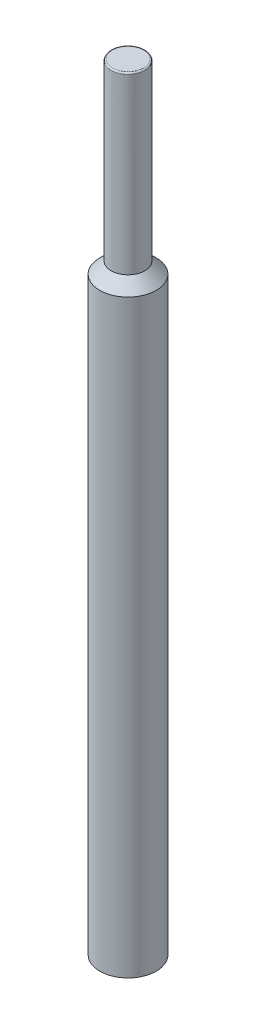
ISO-10303-21;
HEADER;
FILE_DESCRIPTION(('STEP AP214'),'2;1');
FILE_NAME('part.step','',(''),(''),'','','');
FILE_SCHEMA(('AUTOMOTIVE_DESIGN { 1 0 10303 214 1 1 1 1 }'));
ENDSEC;
DATA;
#1=APPLICATION_CONTEXT('core data for automotive mechanical design processes');
#2=APPLICATION_PROTOCOL_DEFINITION('international standard','automotive_design',2000,#1);
#3=PRODUCT_CONTEXT('',#1,'mechanical');
#4=PRODUCT('Part','Part','',(#3));
#5=PRODUCT_RELATED_PRODUCT_CATEGORY('part','',(#4));
#6=PRODUCT_DEFINITION_FORMATION('','',#4);
#7=PRODUCT_DEFINITION_CONTEXT('part definition',#1,'design');
#8=PRODUCT_DEFINITION('design','',#6,#7);
#9=PRODUCT_DEFINITION_SHAPE('','',#8);
#10=(LENGTH_UNIT() NAMED_UNIT(*) SI_UNIT(.MILLI.,.METRE.));
#11=(NAMED_UNIT(*) PLANE_ANGLE_UNIT() SI_UNIT($,.RADIAN.));
#12=(NAMED_UNIT(*) SI_UNIT($,.STERADIAN.) SOLID_ANGLE_UNIT());
#13=UNCERTAINTY_MEASURE_WITH_UNIT(LENGTH_MEASURE(1.E-05),#10,'distance_accuracy_value','');
#14=(GEOMETRIC_REPRESENTATION_CONTEXT(3) GLOBAL_UNCERTAINTY_ASSIGNED_CONTEXT((#13)) GLOBAL_UNIT_ASSIGNED_CONTEXT((#10,
#11,#12)) REPRESENTATION_CONTEXT('',''));
#15=CARTESIAN_POINT('',(0.,0.,0.));
#16=DIRECTION('',(0.,0.,1.));
#17=DIRECTION('',(1.,0.,0.));
#18=AXIS2_PLACEMENT_3D('',#15,#16,#17);
#19=CARTESIAN_POINT('',(0.,0.,0.));
#20=DIRECTION('',(0.,-1.,0.));
#21=DIRECTION('',(0.,0.,-1.));
#22=AXIS2_PLACEMENT_3D('',#19,#20,#21);
#23=PLANE('',#22);
#24=CARTESIAN_POINT('',(0.,0.,0.));
#25=DIRECTION('',(0.,-1.,0.));
#26=DIRECTION('',(0.,0.,-1.));
#27=AXIS2_PLACEMENT_3D('',#24,#25,#26);
#28=CIRCLE('',#27,10.);
#29=CARTESIAN_POINT('',(0.,0.,-10.));
#30=VERTEX_POINT('',#29);
#31=EDGE_CURVE('E52',#30,#30,#28,.T.);
#32=ORIENTED_EDGE('',*,*,#31,.T.);
#33=EDGE_LOOP('',(#32));
#34=FACE_BOUND('',#33,.T.);
#35=ADVANCED_FACE('F41',(#34),#23,.T.);
#36=CARTESIAN_POINT('',(0.,0.,0.));
#37=DIRECTION('',(0.,-1.,0.));
#38=DIRECTION('',(0.,0.,-1.));
#39=AXIS2_PLACEMENT_3D('',#36,#37,#38);
#40=CYLINDRICAL_SURFACE('',#39,10.);
#41=CARTESIAN_POINT('',(0.,209.,0.));
#42=DIRECTION('',(0.,-1.,0.));
#43=DIRECTION('',(0.,0.,-1.));
#44=AXIS2_PLACEMENT_3D('',#41,#42,#43);
#45=CIRCLE('',#44,10.);
#46=CARTESIAN_POINT('',(0.,209.,-10.));
#47=VERTEX_POINT('',#46);
#48=EDGE_CURVE('E56',#47,#47,#45,.T.);
#49=ORIENTED_EDGE('',*,*,#48,.T.);
#50=EDGE_LOOP('',(#49));
#51=FACE_BOUND('',#50,.T.);
#52=ORIENTED_EDGE('',*,*,#31,.F.);
#53=EDGE_LOOP('',(#52));
#54=FACE_BOUND('',#53,.T.);
#55=ADVANCED_FACE('F77',(#51,#54),#40,.T.);
#56=CARTESIAN_POINT('',(0.,209.,0.));
#57=DIRECTION('',(0.,-1.,0.));
#58=DIRECTION('',(0.,0.,-1.));
#59=AXIS2_PLACEMENT_3D('',#56,#57,#58);
#60=CONICAL_SURFACE('',#59,10.,0.785398163397448);
#61=CARTESIAN_POINT('',(0.,213.,0.));
#62=DIRECTION('',(0.,-1.,0.));
#63=DIRECTION('',(0.,0.,-1.));
#64=AXIS2_PLACEMENT_3D('',#61,#62,#63);
#65=CIRCLE('',#64,6.);
#66=CARTESIAN_POINT('',(0.,213.,-6.));
#67=VERTEX_POINT('',#66);
#68=EDGE_CURVE('E61',#67,#67,#65,.T.);
#69=ORIENTED_EDGE('',*,*,#68,.T.);
#70=EDGE_LOOP('',(#69));
#71=FACE_BOUND('',#70,.T.);
#72=ORIENTED_EDGE('',*,*,#48,.F.);
#73=EDGE_LOOP('',(#72));
#74=FACE_BOUND('',#73,.T.);
#75=ADVANCED_FACE('F65',(#71,#74),#60,.T.);
#76=CARTESIAN_POINT('',(0.,0.,0.));
#77=DIRECTION('',(0.,-1.,0.));
#78=DIRECTION('',(0.,0.,-1.));
#79=AXIS2_PLACEMENT_3D('',#76,#77,#78);
#80=CYLINDRICAL_SURFACE('',#79,6.);
#81=CARTESIAN_POINT('',(0.,274.5,0.));
#82=DIRECTION('',(0.,1.,0.));
#83=DIRECTION('',(0.,0.,1.));
#84=AXIS2_PLACEMENT_3D('',#81,#82,#83);
#85=CIRCLE('',#84,6.);
#86=CARTESIAN_POINT('',(0.,274.5,6.));
#87=VERTEX_POINT('',#86);
#88=EDGE_CURVE('E48',#87,#87,#85,.F.);
#89=ORIENTED_EDGE('',*,*,#88,.T.);
#90=EDGE_LOOP('',(#89));
#91=FACE_BOUND('',#90,.T.);
#92=ORIENTED_EDGE('',*,*,#68,.F.);
#93=EDGE_LOOP('',(#92));
#94=FACE_BOUND('',#93,.T.);
#95=ADVANCED_FACE('F68',(#91,#94),#80,.T.);
#96=CARTESIAN_POINT('',(6.,275.,0.));
#97=DIRECTION('',(0.,1.,0.));
#98=DIRECTION('',(0.,0.,1.));
#99=AXIS2_PLACEMENT_3D('',#96,#97,#98);
#100=PLANE('',#99);
#101=CARTESIAN_POINT('',(0.,275.,0.));
#102=DIRECTION('',(0.,1.,0.));
#103=DIRECTION('',(0.,0.,1.));
#104=AXIS2_PLACEMENT_3D('',#101,#102,#103);
#105=CIRCLE('',#104,5.5);
#106=CARTESIAN_POINT('',(0.,275.,5.5));
#107=VERTEX_POINT('',#106);
#108=EDGE_CURVE('E10',#107,#107,#105,.T.);
#109=ORIENTED_EDGE('',*,*,#108,.T.);
#110=EDGE_LOOP('',(#109));
#111=FACE_BOUND('',#110,.T.);
#112=ADVANCED_FACE('F70',(#111),#100,.T.);
#113=CARTESIAN_POINT('',(0.,274.5,0.));
#114=DIRECTION('',(0.,1.,0.));
#115=DIRECTION('',(0.,0.,1.));
#116=AXIS2_PLACEMENT_3D('',#113,#114,#115);
#117=TOROIDAL_SURFACE('',#116,5.5,0.5);
#118=ORIENTED_EDGE('',*,*,#108,.F.);
#119=EDGE_LOOP('',(#118));
#120=FACE_BOUND('',#119,.T.);
#121=ORIENTED_EDGE('',*,*,#88,.F.);
#122=EDGE_LOOP('',(#121));
#123=FACE_BOUND('',#122,.T.);
#124=ADVANCED_FACE('F43',(#120,#123),#117,.T.);
#125=CLOSED_SHELL('',(#35,#55,#75,#95,#112,#124));
#126=MANIFOLD_SOLID_BREP('B2',#125);
#127=ADVANCED_BREP_SHAPE_REPRESENTATION('',(#18,#126),#14);
#128=SHAPE_DEFINITION_REPRESENTATION(#9,#127);
ENDSEC;
END-ISO-10303-21;
